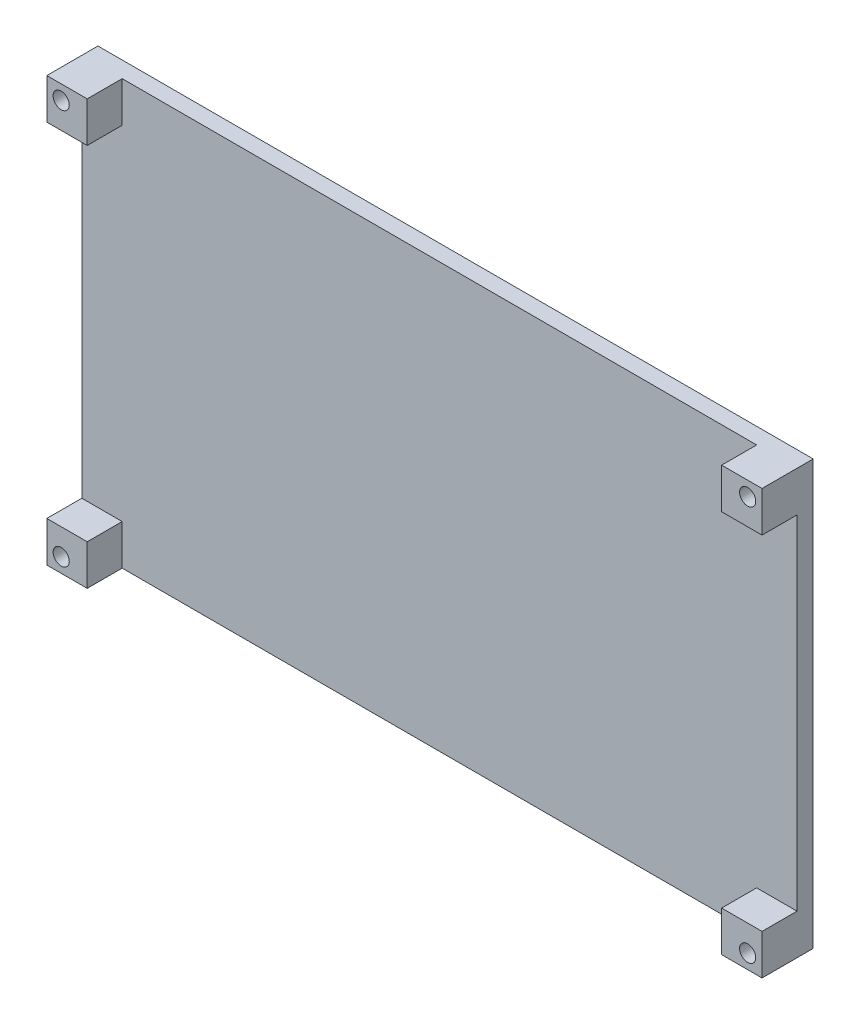
ISO-10303-21;
HEADER;
FILE_DESCRIPTION(('STEP AP214'),'2;1');
FILE_NAME('part.step','',(''),(''),'','','');
FILE_SCHEMA(('AUTOMOTIVE_DESIGN { 1 0 10303 214 1 1 1 1 }'));
ENDSEC;
DATA;
#1=APPLICATION_CONTEXT('core data for automotive mechanical design processes');
#2=APPLICATION_PROTOCOL_DEFINITION('international standard','automotive_design',2000,#1);
#3=PRODUCT_CONTEXT('',#1,'mechanical');
#4=PRODUCT('Part','Part','',(#3));
#5=PRODUCT_RELATED_PRODUCT_CATEGORY('part','',(#4));
#6=PRODUCT_DEFINITION_FORMATION('','',#4);
#7=PRODUCT_DEFINITION_CONTEXT('part definition',#1,'design');
#8=PRODUCT_DEFINITION('design','',#6,#7);
#9=PRODUCT_DEFINITION_SHAPE('','',#8);
#10=(LENGTH_UNIT() NAMED_UNIT(*) SI_UNIT(.MILLI.,.METRE.));
#11=(NAMED_UNIT(*) PLANE_ANGLE_UNIT() SI_UNIT($,.RADIAN.));
#12=(NAMED_UNIT(*) SI_UNIT($,.STERADIAN.) SOLID_ANGLE_UNIT());
#13=UNCERTAINTY_MEASURE_WITH_UNIT(LENGTH_MEASURE(1.E-05),#10,'distance_accuracy_value','');
#14=(GEOMETRIC_REPRESENTATION_CONTEXT(3) GLOBAL_UNCERTAINTY_ASSIGNED_CONTEXT((#13)) GLOBAL_UNIT_ASSIGNED_CONTEXT((#10,
#11,#12)) REPRESENTATION_CONTEXT('',''));
#15=CARTESIAN_POINT('',(0.,0.,0.));
#16=DIRECTION('',(0.,0.,1.));
#17=DIRECTION('',(1.,0.,0.));
#18=AXIS2_PLACEMENT_3D('',#15,#16,#17);
#19=CARTESIAN_POINT('',(6.975,0.,-36.5));
#20=DIRECTION('',(1.,0.,0.));
#21=DIRECTION('',(0.,1.,0.));
#22=AXIS2_PLACEMENT_3D('',#19,#20,#21);
#23=PLANE('',#22);
#24=CARTESIAN_POINT('',(6.975,-31.37,-16.5));
#25=DIRECTION('',(1.,0.,0.));
#26=DIRECTION('',(0.,1.,0.));
#27=AXIS2_PLACEMENT_3D('',#24,#25,#26);
#28=CIRCLE('',#27,2.);
#29=CARTESIAN_POINT('',(6.975,-29.37,-16.5));
#30=VERTEX_POINT('',#29);
#31=EDGE_CURVE('E203',#30,#30,#28,.T.);
#32=ORIENTED_EDGE('',*,*,#31,.T.);
#33=EDGE_LOOP('',(#32));
#34=FACE_BOUND('',#33,.T.);
#35=DIRECTION('',(0.,0.581238193719096,0.813733471206735));
#36=VECTOR('',#35,1.);
#37=CARTESIAN_POINT('',(6.97499999999999,-26.0693243243243,-17.8790540540541));
#38=LINE('',#37,#36);
#39=CARTESIAN_POINT('',(6.97499999999999,-25.7669989659495,-17.4557985523293));
#40=VERTEX_POINT('',#39);
#41=CARTESIAN_POINT('',(6.97499999999998,-14.37,-1.5));
#42=VERTEX_POINT('',#41);
#43=EDGE_CURVE('E213',#40,#42,#38,.T.);
#44=ORIENTED_EDGE('',*,*,#43,.F.);
#45=CARTESIAN_POINT('',(6.97500000000001,-31.87,-13.0965120994361));
#46=DIRECTION('',(1.,0.,0.));
#47=DIRECTION('',(0.,1.,0.));
#48=AXIS2_PLACEMENT_3D('',#45,#46,#47);
#49=CIRCLE('',#48,7.5);
#50=CARTESIAN_POINT('',(6.97499999999999,-39.37,-13.0965120994361));
#51=VERTEX_POINT('',#50);
#52=EDGE_CURVE('E403',#40,#51,#49,.F.);
#53=ORIENTED_EDGE('',*,*,#52,.T.);
#54=DIRECTION('',(0.,0.,1.));
#55=VECTOR('',#54,1.);
#56=CARTESIAN_POINT('',(6.97499999999999,-39.37,-36.5));
#57=LINE('',#56,#55);
#58=CARTESIAN_POINT('',(6.97499999999999,-39.37,-1.5));
#59=VERTEX_POINT('',#58);
#60=EDGE_CURVE('E238',#51,#59,#57,.T.);
#61=ORIENTED_EDGE('',*,*,#60,.T.);
#62=DIRECTION('',(0.,1.,0.));
#63=VECTOR('',#62,1.);
#64=CARTESIAN_POINT('',(6.975,0.,-1.5));
#65=LINE('',#64,#63);
#66=EDGE_CURVE('E227',#59,#42,#65,.T.);
#67=ORIENTED_EDGE('',*,*,#66,.T.);
#68=EDGE_LOOP('',(#44,#53,#61,#67));
#69=FACE_BOUND('',#68,.T.);
#70=ADVANCED_FACE('F34',(#34,#69),#23,.F.);
#71=CARTESIAN_POINT('',(16.975,0.,-36.5));
#72=DIRECTION('',(1.,0.,0.));
#73=DIRECTION('',(0.,0.,-1.));
#74=AXIS2_PLACEMENT_3D('',#71,#72,#73);
#75=PLANE('',#74);
#76=CARTESIAN_POINT('',(16.975,-31.37,-16.5));
#77=DIRECTION('',(1.,0.,0.));
#78=DIRECTION('',(0.,0.,-1.));
#79=AXIS2_PLACEMENT_3D('',#76,#77,#78);
#80=CIRCLE('',#79,2.);
#81=CARTESIAN_POINT('',(16.975,-31.37,-18.5));
#82=VERTEX_POINT('',#81);
#83=EDGE_CURVE('E400',#82,#82,#80,.T.);
#84=ORIENTED_EDGE('',*,*,#83,.F.);
#85=EDGE_LOOP('',(#84));
#86=FACE_BOUND('',#85,.T.);
#87=DIRECTION('',(0.,0.,1.));
#88=VECTOR('',#87,1.);
#89=CARTESIAN_POINT('',(16.975,-39.37,-36.5));
#90=LINE('',#89,#88);
#91=CARTESIAN_POINT('',(16.975,-39.37,-13.0965120994361));
#92=VERTEX_POINT('',#91);
#93=CARTESIAN_POINT('',(16.975,-39.37,-1.5));
#94=VERTEX_POINT('',#93);
#95=EDGE_CURVE('E236',#92,#94,#90,.T.);
#96=ORIENTED_EDGE('',*,*,#95,.F.);
#97=CARTESIAN_POINT('',(16.975,-31.87,-13.0965120994361));
#98=DIRECTION('',(1.,0.,0.));
#99=DIRECTION('',(0.,0.,-1.));
#100=AXIS2_PLACEMENT_3D('',#97,#98,#99);
#101=CIRCLE('',#100,7.5);
#102=CARTESIAN_POINT('',(16.975,-25.7669989659495,-17.4557985523293));
#103=VERTEX_POINT('',#102);
#104=EDGE_CURVE('E409',#92,#103,#101,.T.);
#105=ORIENTED_EDGE('',*,*,#104,.T.);
#106=DIRECTION('',(0.,0.581238193719096,0.813733471206735));
#107=VECTOR('',#106,1.);
#108=CARTESIAN_POINT('',(16.975,-26.0693243243243,-17.8790540540541));
#109=LINE('',#108,#107);
#110=CARTESIAN_POINT('',(16.975,-14.37,-1.5));
#111=VERTEX_POINT('',#110);
#112=EDGE_CURVE('E202',#103,#111,#109,.T.);
#113=ORIENTED_EDGE('',*,*,#112,.T.);
#114=DIRECTION('',(0.,1.,0.));
#115=VECTOR('',#114,1.);
#116=CARTESIAN_POINT('',(16.975,0.,-1.5));
#117=LINE('',#116,#115);
#118=EDGE_CURVE('E233',#94,#111,#117,.T.);
#119=ORIENTED_EDGE('',*,*,#118,.F.);
#120=EDGE_LOOP('',(#96,#105,#113,#119));
#121=FACE_BOUND('',#120,.T.);
#122=ADVANCED_FACE('F422',(#86,#121),#75,.T.);
#123=CARTESIAN_POINT('',(-6.975,0.,-36.5));
#124=DIRECTION('',(1.,0.,0.));
#125=DIRECTION('',(0.,1.,0.));
#126=AXIS2_PLACEMENT_3D('',#123,#124,#125);
#127=PLANE('',#126);
#128=CARTESIAN_POINT('',(-6.975,-31.37,-16.5));
#129=DIRECTION('',(1.,0.,0.));
#130=DIRECTION('',(0.,1.,0.));
#131=AXIS2_PLACEMENT_3D('',#128,#129,#130);
#132=CIRCLE('',#131,2.);
#133=CARTESIAN_POINT('',(-6.975,-29.37,-16.5));
#134=VERTEX_POINT('',#133);
#135=EDGE_CURVE('E399',#134,#134,#132,.T.);
#136=ORIENTED_EDGE('',*,*,#135,.F.);
#137=EDGE_LOOP('',(#136));
#138=FACE_BOUND('',#137,.T.);
#139=DIRECTION('',(0.,0.,1.));
#140=VECTOR('',#139,1.);
#141=CARTESIAN_POINT('',(-6.975,-39.37,-36.5));
#142=LINE('',#141,#140);
#143=CARTESIAN_POINT('',(-6.975,-39.37,-13.0965120994361));
#144=VERTEX_POINT('',#143);
#145=CARTESIAN_POINT('',(-6.975,-39.37,-1.5));
#146=VERTEX_POINT('',#145);
#147=EDGE_CURVE('E221',#144,#146,#142,.T.);
#148=ORIENTED_EDGE('',*,*,#147,.F.);
#149=CARTESIAN_POINT('',(-6.97500000000001,-31.87,-13.0965120994361));
#150=DIRECTION('',(1.,0.,0.));
#151=DIRECTION('',(0.,1.,0.));
#152=AXIS2_PLACEMENT_3D('',#149,#150,#151);
#153=CIRCLE('',#152,7.5);
#154=CARTESIAN_POINT('',(-6.975,-25.7669989659495,-17.4557985523293));
#155=VERTEX_POINT('',#154);
#156=EDGE_CURVE('E11',#144,#155,#153,.T.);
#157=ORIENTED_EDGE('',*,*,#156,.T.);
#158=DIRECTION('',(0.,0.581238193719096,0.813733471206735));
#159=VECTOR('',#158,1.);
#160=CARTESIAN_POINT('',(-6.975,-26.0693243243243,-17.8790540540541));
#161=LINE('',#160,#159);
#162=CARTESIAN_POINT('',(-6.975,-14.37,-1.5));
#163=VERTEX_POINT('',#162);
#164=EDGE_CURVE('E393',#155,#163,#161,.T.);
#165=ORIENTED_EDGE('',*,*,#164,.T.);
#166=DIRECTION('',(0.,1.,0.));
#167=VECTOR('',#166,1.);
#168=CARTESIAN_POINT('',(-6.975,0.,-1.5));
#169=LINE('',#168,#167);
#170=EDGE_CURVE('E219',#146,#163,#169,.T.);
#171=ORIENTED_EDGE('',*,*,#170,.F.);
#172=EDGE_LOOP('',(#148,#157,#165,#171));
#173=FACE_BOUND('',#172,.T.);
#174=ADVANCED_FACE('F428',(#138,#173),#127,.T.);
#175=CARTESIAN_POINT('',(0.,0.,-1.5));
#176=DIRECTION('',(0.,0.,1.));
#177=DIRECTION('',(1.,0.,0.));
#178=AXIS2_PLACEMENT_3D('',#175,#176,#177);
#179=PLANE('',#178);
#180=ORIENTED_EDGE('',*,*,#170,.T.);
#181=DIRECTION('',(1.,0.,0.));
#182=VECTOR('',#181,1.);
#183=CARTESIAN_POINT('',(0.,-14.37,-1.5));
#184=LINE('',#183,#182);
#185=CARTESIAN_POINT('',(-16.975,-14.37,-1.5));
#186=VERTEX_POINT('',#185);
#187=EDGE_CURVE('E198',#186,#163,#184,.T.);
#188=ORIENTED_EDGE('',*,*,#187,.F.);
#189=DIRECTION('',(0.,1.,0.));
#190=VECTOR('',#189,1.);
#191=CARTESIAN_POINT('',(-16.975,0.,-1.5));
#192=LINE('',#191,#190);
#193=CARTESIAN_POINT('',(-16.975,-39.37,-1.5));
#194=VERTEX_POINT('',#193);
#195=EDGE_CURVE('E206',#194,#186,#192,.T.);
#196=ORIENTED_EDGE('',*,*,#195,.F.);
#197=DIRECTION('',(1.,0.,0.));
#198=VECTOR('',#197,1.);
#199=CARTESIAN_POINT('',(0.,-39.37,-1.5));
#200=LINE('',#199,#198);
#201=CARTESIAN_POINT('',(-66.42,-39.37,-1.5));
#202=VERTEX_POINT('',#201);
#203=EDGE_CURVE('E344',#202,#194,#200,.T.);
#204=ORIENTED_EDGE('',*,*,#203,.F.);
#205=DIRECTION('',(0.,1.,0.));
#206=VECTOR('',#205,1.);
#207=CARTESIAN_POINT('',(-66.42,0.,-1.5));
#208=LINE('',#207,#206);
#209=CARTESIAN_POINT('',(-66.42,39.37,-1.5));
#210=VERTEX_POINT('',#209);
#211=EDGE_CURVE('E327',#202,#210,#208,.T.);
#212=ORIENTED_EDGE('',*,*,#211,.T.);
#213=DIRECTION('',(1.,0.,0.));
#214=VECTOR('',#213,1.);
#215=CARTESIAN_POINT('',(0.,39.37,-1.5));
#216=LINE('',#215,#214);
#217=CARTESIAN_POINT('',(66.42,39.37,-1.5));
#218=VERTEX_POINT('',#217);
#219=EDGE_CURVE('E350',#210,#218,#216,.T.);
#220=ORIENTED_EDGE('',*,*,#219,.T.);
#221=DIRECTION('',(0.,1.,0.));
#222=VECTOR('',#221,1.);
#223=CARTESIAN_POINT('',(66.42,0.,-1.5));
#224=LINE('',#223,#222);
#225=CARTESIAN_POINT('',(66.42,-39.37,-1.5));
#226=VERTEX_POINT('',#225);
#227=EDGE_CURVE('E346',#226,#218,#224,.T.);
#228=ORIENTED_EDGE('',*,*,#227,.F.);
#229=EDGE_CURVE('E343',#94,#226,#200,.T.);
#230=ORIENTED_EDGE('',*,*,#229,.F.);
#231=ORIENTED_EDGE('',*,*,#118,.T.);
#232=DIRECTION('',(-1.,0.,0.));
#233=VECTOR('',#232,1.);
#234=CARTESIAN_POINT('',(0.,-14.37,-1.5));
#235=LINE('',#234,#233);
#236=EDGE_CURVE('E230',#111,#42,#235,.T.);
#237=ORIENTED_EDGE('',*,*,#236,.T.);
#238=ORIENTED_EDGE('',*,*,#66,.F.);
#239=EDGE_CURVE('E347',#146,#59,#200,.T.);
#240=ORIENTED_EDGE('',*,*,#239,.F.);
#241=EDGE_LOOP('',(#180,#188,#196,#204,#212,#220,#228,#230,#231,#237,#238,#240));
#242=FACE_BOUND('',#241,.T.);
#243=CARTESIAN_POINT('',(-63.75,36.7,-1.5));
#244=DIRECTION('',(0.,0.,1.));
#245=DIRECTION('',(1.,0.,0.));
#246=AXIS2_PLACEMENT_3D('',#243,#244,#245);
#247=CIRCLE('',#246,1.5);
#248=CARTESIAN_POINT('',(-62.25,36.7,-1.5));
#249=VERTEX_POINT('',#248);
#250=EDGE_CURVE('E353',#249,#249,#247,.T.);
#251=ORIENTED_EDGE('',*,*,#250,.T.);
#252=EDGE_LOOP('',(#251));
#253=FACE_BOUND('',#252,.T.);
#254=CARTESIAN_POINT('',(63.75,36.7,-1.5));
#255=DIRECTION('',(0.,0.,1.));
#256=DIRECTION('',(1.,0.,0.));
#257=AXIS2_PLACEMENT_3D('',#254,#255,#256);
#258=CIRCLE('',#257,1.50000000000001);
#259=CARTESIAN_POINT('',(65.25,36.7,-1.5));
#260=VERTEX_POINT('',#259);
#261=EDGE_CURVE('E356',#260,#260,#258,.F.);
#262=ORIENTED_EDGE('',*,*,#261,.F.);
#263=EDGE_LOOP('',(#262));
#264=FACE_BOUND('',#263,.T.);
#265=CARTESIAN_POINT('',(63.75,-36.7,-1.5));
#266=DIRECTION('',(0.,0.,1.));
#267=DIRECTION('',(1.,0.,0.));
#268=AXIS2_PLACEMENT_3D('',#265,#266,#267);
#269=CIRCLE('',#268,1.50000000000001);
#270=CARTESIAN_POINT('',(65.25,-36.7,-1.5));
#271=VERTEX_POINT('',#270);
#272=EDGE_CURVE('E359',#271,#271,#269,.T.);
#273=ORIENTED_EDGE('',*,*,#272,.T.);
#274=EDGE_LOOP('',(#273));
#275=FACE_BOUND('',#274,.T.);
#276=CARTESIAN_POINT('',(-63.75,-36.7,-1.5));
#277=DIRECTION('',(0.,0.,1.));
#278=DIRECTION('',(1.,0.,0.));
#279=AXIS2_PLACEMENT_3D('',#276,#277,#278);
#280=CIRCLE('',#279,1.5);
#281=CARTESIAN_POINT('',(-62.25,-36.7,-1.5));
#282=VERTEX_POINT('',#281);
#283=EDGE_CURVE('E332',#282,#282,#280,.F.);
#284=ORIENTED_EDGE('',*,*,#283,.F.);
#285=EDGE_LOOP('',(#284));
#286=FACE_BOUND('',#285,.T.);
#287=ADVANCED_FACE('F215',(#242,#253,#264,#275,#286),#179,.F.);
#288=CARTESIAN_POINT('',(-66.42,0.,1.5));
#289=DIRECTION('',(-1.,0.,0.));
#290=DIRECTION('',(0.,0.,1.));
#291=AXIS2_PLACEMENT_3D('',#288,#289,#290);
#292=PLANE('',#291);
#293=DIRECTION('',(0.,1.,0.));
#294=VECTOR('',#293,1.);
#295=CARTESIAN_POINT('',(-66.42,0.,1.5));
#296=LINE('',#295,#294);
#297=CARTESIAN_POINT('',(-66.42,-31.87,1.5));
#298=VERTEX_POINT('',#297);
#299=CARTESIAN_POINT('',(-66.42,31.87,1.5));
#300=VERTEX_POINT('',#299);
#301=EDGE_CURVE('E328',#298,#300,#296,.T.);
#302=ORIENTED_EDGE('',*,*,#301,.T.);
#303=DIRECTION('',(0.,0.,-1.));
#304=VECTOR('',#303,1.);
#305=CARTESIAN_POINT('',(-66.42,31.87,8.));
#306=LINE('',#305,#304);
#307=CARTESIAN_POINT('',(-66.42,31.87,8.));
#308=VERTEX_POINT('',#307);
#309=EDGE_CURVE('E301',#308,#300,#306,.T.);
#310=ORIENTED_EDGE('',*,*,#309,.F.);
#311=DIRECTION('',(0.,1.,0.));
#312=VECTOR('',#311,1.);
#313=CARTESIAN_POINT('',(-66.42,0.,8.));
#314=LINE('',#313,#312);
#315=CARTESIAN_POINT('',(-66.42,39.37,8.));
#316=VERTEX_POINT('',#315);
#317=EDGE_CURVE('E293',#308,#316,#314,.T.);
#318=ORIENTED_EDGE('',*,*,#317,.T.);
#319=DIRECTION('',(0.,0.,-1.));
#320=VECTOR('',#319,1.);
#321=CARTESIAN_POINT('',(-66.42,39.37,1.5));
#322=LINE('',#321,#320);
#323=EDGE_CURVE('E340',#316,#210,#322,.T.);
#324=ORIENTED_EDGE('',*,*,#323,.T.);
#325=ORIENTED_EDGE('',*,*,#211,.F.);
#326=DIRECTION('',(0.,0.,-1.));
#327=VECTOR('',#326,1.);
#328=CARTESIAN_POINT('',(-66.42,-39.37,1.5));
#329=LINE('',#328,#327);
#330=CARTESIAN_POINT('',(-66.42,-39.37,8.));
#331=VERTEX_POINT('',#330);
#332=EDGE_CURVE('E370',#331,#202,#329,.T.);
#333=ORIENTED_EDGE('',*,*,#332,.F.);
#334=DIRECTION('',(0.,1.,0.));
#335=VECTOR('',#334,1.);
#336=CARTESIAN_POINT('',(-66.42,0.,8.));
#337=LINE('',#336,#335);
#338=CARTESIAN_POINT('',(-66.42,-31.87,8.));
#339=VERTEX_POINT('',#338);
#340=EDGE_CURVE('E309',#331,#339,#337,.T.);
#341=ORIENTED_EDGE('',*,*,#340,.T.);
#342=DIRECTION('',(0.,0.,-1.));
#343=VECTOR('',#342,1.);
#344=CARTESIAN_POINT('',(-66.42,-31.87,8.));
#345=LINE('',#344,#343);
#346=EDGE_CURVE('E324',#339,#298,#345,.T.);
#347=ORIENTED_EDGE('',*,*,#346,.T.);
#348=EDGE_LOOP('',(#302,#310,#318,#324,#325,#333,#341,#347));
#349=FACE_BOUND('',#348,.T.);
#350=ADVANCED_FACE('F490',(#349),#292,.T.);
#351=CARTESIAN_POINT('',(0.,-39.37,1.5));
#352=DIRECTION('',(0.,1.,0.));
#353=DIRECTION('',(0.,0.,1.));
#354=AXIS2_PLACEMENT_3D('',#351,#352,#353);
#355=PLANE('',#354);
#356=ORIENTED_EDGE('',*,*,#60,.F.);
#357=DIRECTION('',(-1.,0.,0.));
#358=VECTOR('',#357,1.);
#359=CARTESIAN_POINT('',(16.975,-39.37,-13.0965120994361));
#360=LINE('',#359,#358);
#361=EDGE_CURVE('E407',#51,#92,#360,.F.);
#362=ORIENTED_EDGE('',*,*,#361,.T.);
#363=ORIENTED_EDGE('',*,*,#95,.T.);
#364=ORIENTED_EDGE('',*,*,#229,.T.);
#365=DIRECTION('',(0.,0.,-1.));
#366=VECTOR('',#365,1.);
#367=CARTESIAN_POINT('',(66.42,-39.37,1.5));
#368=LINE('',#367,#366);
#369=CARTESIAN_POINT('',(66.42,-39.37,8.));
#370=VERTEX_POINT('',#369);
#371=EDGE_CURVE('E367',#370,#226,#368,.T.);
#372=ORIENTED_EDGE('',*,*,#371,.F.);
#373=DIRECTION('',(1.,0.,0.));
#374=VECTOR('',#373,1.);
#375=CARTESIAN_POINT('',(0.,-39.37,8.));
#376=LINE('',#375,#374);
#377=CARTESIAN_POINT('',(58.92,-39.37,8.));
#378=VERTEX_POINT('',#377);
#379=EDGE_CURVE('E246',#378,#370,#376,.T.);
#380=ORIENTED_EDGE('',*,*,#379,.F.);
#381=DIRECTION('',(0.,0.,-1.));
#382=VECTOR('',#381,1.);
#383=CARTESIAN_POINT('',(58.92,-39.37,8.));
#384=LINE('',#383,#382);
#385=CARTESIAN_POINT('',(58.92,-39.37,1.5));
#386=VERTEX_POINT('',#385);
#387=EDGE_CURVE('E259',#378,#386,#384,.T.);
#388=ORIENTED_EDGE('',*,*,#387,.T.);
#389=DIRECTION('',(1.,0.,0.));
#390=VECTOR('',#389,1.);
#391=CARTESIAN_POINT('',(0.,-39.37,1.5));
#392=LINE('',#391,#390);
#393=CARTESIAN_POINT('',(-58.92,-39.37,1.5));
#394=VERTEX_POINT('',#393);
#395=EDGE_CURVE('E331',#394,#386,#392,.T.);
#396=ORIENTED_EDGE('',*,*,#395,.F.);
#397=DIRECTION('',(0.,0.,-1.));
#398=VECTOR('',#397,1.);
#399=CARTESIAN_POINT('',(-58.92,-39.37,8.));
#400=LINE('',#399,#398);
#401=CARTESIAN_POINT('',(-58.92,-39.37,8.));
#402=VERTEX_POINT('',#401);
#403=EDGE_CURVE('E322',#402,#394,#400,.T.);
#404=ORIENTED_EDGE('',*,*,#403,.F.);
#405=DIRECTION('',(1.,0.,0.));
#406=VECTOR('',#405,1.);
#407=CARTESIAN_POINT('',(0.,-39.37,8.));
#408=LINE('',#407,#406);
#409=EDGE_CURVE('E312',#331,#402,#408,.T.);
#410=ORIENTED_EDGE('',*,*,#409,.F.);
#411=ORIENTED_EDGE('',*,*,#332,.T.);
#412=ORIENTED_EDGE('',*,*,#203,.T.);
#413=DIRECTION('',(0.,0.,1.));
#414=VECTOR('',#413,1.);
#415=CARTESIAN_POINT('',(-16.975,-39.37,-36.5));
#416=LINE('',#415,#414);
#417=CARTESIAN_POINT('',(-16.975,-39.37,-13.0965120994361));
#418=VERTEX_POINT('',#417);
#419=EDGE_CURVE('E209',#418,#194,#416,.T.);
#420=ORIENTED_EDGE('',*,*,#419,.F.);
#421=DIRECTION('',(-1.,0.,0.));
#422=VECTOR('',#421,1.);
#423=CARTESIAN_POINT('',(-6.97500000000001,-39.37,-13.0965120994361));
#424=LINE('',#423,#422);
#425=EDGE_CURVE('E405',#418,#144,#424,.F.);
#426=ORIENTED_EDGE('',*,*,#425,.T.);
#427=ORIENTED_EDGE('',*,*,#147,.T.);
#428=ORIENTED_EDGE('',*,*,#239,.T.);
#429=EDGE_LOOP('',(#356,#362,#363,#364,#372,#380,#388,#396,#404,#410,#411,#412,#420,#426,#427,#428));
#430=FACE_BOUND('',#429,.T.);
#431=ADVANCED_FACE('F413',(#430),#355,.F.);
#432=CARTESIAN_POINT('',(66.42,0.,1.5));
#433=DIRECTION('',(-1.,0.,0.));
#434=DIRECTION('',(0.,0.,1.));
#435=AXIS2_PLACEMENT_3D('',#432,#433,#434);
#436=PLANE('',#435);
#437=DIRECTION('',(0.,1.,0.));
#438=VECTOR('',#437,1.);
#439=CARTESIAN_POINT('',(66.42,0.,1.5));
#440=LINE('',#439,#438);
#441=CARTESIAN_POINT('',(66.42,-31.87,1.5));
#442=VERTEX_POINT('',#441);
#443=CARTESIAN_POINT('',(66.42,31.87,1.5));
#444=VERTEX_POINT('',#443);
#445=EDGE_CURVE('E335',#442,#444,#440,.T.);
#446=ORIENTED_EDGE('',*,*,#445,.F.);
#447=DIRECTION('',(0.,0.,-1.));
#448=VECTOR('',#447,1.);
#449=CARTESIAN_POINT('',(66.42,-31.87,8.));
#450=LINE('',#449,#448);
#451=CARTESIAN_POINT('',(66.42,-31.87,8.));
#452=VERTEX_POINT('',#451);
#453=EDGE_CURVE('E257',#452,#442,#450,.T.);
#454=ORIENTED_EDGE('',*,*,#453,.F.);
#455=DIRECTION('',(0.,1.,0.));
#456=VECTOR('',#455,1.);
#457=CARTESIAN_POINT('',(66.42,0.,8.));
#458=LINE('',#457,#456);
#459=EDGE_CURVE('E249',#370,#452,#458,.T.);
#460=ORIENTED_EDGE('',*,*,#459,.F.);
#461=ORIENTED_EDGE('',*,*,#371,.T.);
#462=ORIENTED_EDGE('',*,*,#227,.T.);
#463=DIRECTION('',(0.,0.,-1.));
#464=VECTOR('',#463,1.);
#465=CARTESIAN_POINT('',(66.42,39.37,1.5));
#466=LINE('',#465,#464);
#467=CARTESIAN_POINT('',(66.42,39.37,8.));
#468=VERTEX_POINT('',#467);
#469=EDGE_CURVE('E365',#468,#218,#466,.T.);
#470=ORIENTED_EDGE('',*,*,#469,.F.);
#471=DIRECTION('',(0.,1.,0.));
#472=VECTOR('',#471,1.);
#473=CARTESIAN_POINT('',(66.42,0.,8.));
#474=LINE('',#473,#472);
#475=CARTESIAN_POINT('',(66.42,31.87,8.));
#476=VERTEX_POINT('',#475);
#477=EDGE_CURVE('E265',#476,#468,#474,.T.);
#478=ORIENTED_EDGE('',*,*,#477,.F.);
#479=DIRECTION('',(0.,0.,-1.));
#480=VECTOR('',#479,1.);
#481=CARTESIAN_POINT('',(66.42,31.87,8.));
#482=LINE('',#481,#480);
#483=EDGE_CURVE('E281',#476,#444,#482,.T.);
#484=ORIENTED_EDGE('',*,*,#483,.T.);
#485=EDGE_LOOP('',(#446,#454,#460,#461,#462,#470,#478,#484));
#486=FACE_BOUND('',#485,.T.);
#487=ADVANCED_FACE('F499',(#486),#436,.F.);
#488=CARTESIAN_POINT('',(63.75,-36.7,1.5));
#489=DIRECTION('',(0.,0.,-1.));
#490=DIRECTION('',(-1.,0.,0.));
#491=AXIS2_PLACEMENT_3D('',#488,#489,#490);
#492=CYLINDRICAL_SURFACE('',#491,1.50000000000001);
#493=CARTESIAN_POINT('',(63.75,-36.7,8.));
#494=DIRECTION('',(0.,0.,1.));
#495=DIRECTION('',(1.,0.,0.));
#496=AXIS2_PLACEMENT_3D('',#493,#494,#495);
#497=CIRCLE('',#496,1.50000000000001);
#498=CARTESIAN_POINT('',(65.25,-36.7,8.));
#499=VERTEX_POINT('',#498);
#500=EDGE_CURVE('E240',#499,#499,#497,.T.);
#501=ORIENTED_EDGE('',*,*,#500,.T.);
#502=EDGE_LOOP('',(#501));
#503=FACE_BOUND('',#502,.T.);
#504=ORIENTED_EDGE('',*,*,#272,.F.);
#505=EDGE_LOOP('',(#504));
#506=FACE_BOUND('',#505,.T.);
#507=ADVANCED_FACE('F495',(#503,#506),#492,.F.);
#508=CARTESIAN_POINT('',(63.75,36.7,1.5));
#509=DIRECTION('',(0.,0.,-1.));
#510=DIRECTION('',(-1.,0.,0.));
#511=AXIS2_PLACEMENT_3D('',#508,#509,#510);
#512=CYLINDRICAL_SURFACE('',#511,1.50000000000001);
#513=CARTESIAN_POINT('',(63.75,36.7,8.));
#514=DIRECTION('',(0.,0.,1.));
#515=DIRECTION('',(1.,0.,0.));
#516=AXIS2_PLACEMENT_3D('',#513,#514,#515);
#517=CIRCLE('',#516,1.50000000000001);
#518=CARTESIAN_POINT('',(65.25,36.7,8.));
#519=VERTEX_POINT('',#518);
#520=EDGE_CURVE('E273',#519,#519,#517,.F.);
#521=ORIENTED_EDGE('',*,*,#520,.F.);
#522=EDGE_LOOP('',(#521));
#523=FACE_BOUND('',#522,.T.);
#524=ORIENTED_EDGE('',*,*,#261,.T.);
#525=EDGE_LOOP('',(#524));
#526=FACE_BOUND('',#525,.T.);
#527=ADVANCED_FACE('F498',(#523,#526),#512,.F.);
#528=CARTESIAN_POINT('',(-63.75,36.7,1.5));
#529=DIRECTION('',(0.,0.,-1.));
#530=DIRECTION('',(-1.,0.,0.));
#531=AXIS2_PLACEMENT_3D('',#528,#529,#530);
#532=CYLINDRICAL_SURFACE('',#531,1.5);
#533=CARTESIAN_POINT('',(-63.75,36.7,8.));
#534=DIRECTION('',(0.,0.,1.));
#535=DIRECTION('',(1.,0.,0.));
#536=AXIS2_PLACEMENT_3D('',#533,#534,#535);
#537=CIRCLE('',#536,1.5);
#538=CARTESIAN_POINT('',(-62.25,36.7,8.));
#539=VERTEX_POINT('',#538);
#540=EDGE_CURVE('E284',#539,#539,#537,.T.);
#541=ORIENTED_EDGE('',*,*,#540,.T.);
#542=EDGE_LOOP('',(#541));
#543=FACE_BOUND('',#542,.T.);
#544=ORIENTED_EDGE('',*,*,#250,.F.);
#545=EDGE_LOOP('',(#544));
#546=FACE_BOUND('',#545,.T.);
#547=ADVANCED_FACE('F503',(#543,#546),#532,.F.);
#548=CARTESIAN_POINT('',(0.,39.37,1.5));
#549=DIRECTION('',(0.,1.,0.));
#550=DIRECTION('',(0.,0.,1.));
#551=AXIS2_PLACEMENT_3D('',#548,#549,#550);
#552=PLANE('',#551);
#553=DIRECTION('',(1.,0.,0.));
#554=VECTOR('',#553,1.);
#555=CARTESIAN_POINT('',(0.,39.37,1.5));
#556=LINE('',#555,#554);
#557=CARTESIAN_POINT('',(-58.92,39.37,1.5));
#558=VERTEX_POINT('',#557);
#559=CARTESIAN_POINT('',(58.92,39.37,1.5));
#560=VERTEX_POINT('',#559);
#561=EDGE_CURVE('E337',#558,#560,#556,.T.);
#562=ORIENTED_EDGE('',*,*,#561,.T.);
#563=DIRECTION('',(0.,0.,-1.));
#564=VECTOR('',#563,1.);
#565=CARTESIAN_POINT('',(58.92,39.37,8.));
#566=LINE('',#565,#564);
#567=CARTESIAN_POINT('',(58.92,39.37,8.));
#568=VERTEX_POINT('',#567);
#569=EDGE_CURVE('E279',#568,#560,#566,.T.);
#570=ORIENTED_EDGE('',*,*,#569,.F.);
#571=DIRECTION('',(1.,0.,0.));
#572=VECTOR('',#571,1.);
#573=CARTESIAN_POINT('',(0.,39.37,8.));
#574=LINE('',#573,#572);
#575=EDGE_CURVE('E268',#568,#468,#574,.T.);
#576=ORIENTED_EDGE('',*,*,#575,.T.);
#577=ORIENTED_EDGE('',*,*,#469,.T.);
#578=ORIENTED_EDGE('',*,*,#219,.F.);
#579=ORIENTED_EDGE('',*,*,#323,.F.);
#580=DIRECTION('',(1.,0.,0.));
#581=VECTOR('',#580,1.);
#582=CARTESIAN_POINT('',(0.,39.37,8.));
#583=LINE('',#582,#581);
#584=CARTESIAN_POINT('',(-58.92,39.37,8.));
#585=VERTEX_POINT('',#584);
#586=EDGE_CURVE('E290',#316,#585,#583,.T.);
#587=ORIENTED_EDGE('',*,*,#586,.T.);
#588=DIRECTION('',(0.,0.,-1.));
#589=VECTOR('',#588,1.);
#590=CARTESIAN_POINT('',(-58.92,39.37,8.));
#591=LINE('',#590,#589);
#592=EDGE_CURVE('E303',#585,#558,#591,.T.);
#593=ORIENTED_EDGE('',*,*,#592,.T.);
#594=EDGE_LOOP('',(#562,#570,#576,#577,#578,#579,#587,#593));
#595=FACE_BOUND('',#594,.T.);
#596=ADVANCED_FACE('F493',(#595),#552,.T.);
#597=CARTESIAN_POINT('',(-63.75,-36.7,1.5));
#598=DIRECTION('',(0.,0.,-1.));
#599=DIRECTION('',(-1.,0.,0.));
#600=AXIS2_PLACEMENT_3D('',#597,#598,#599);
#601=CYLINDRICAL_SURFACE('',#600,1.5);
#602=CARTESIAN_POINT('',(-63.75,-36.7,8.));
#603=DIRECTION('',(0.,0.,1.));
#604=DIRECTION('',(1.,0.,0.));
#605=AXIS2_PLACEMENT_3D('',#602,#603,#604);
#606=CIRCLE('',#605,1.5);
#607=CARTESIAN_POINT('',(-62.25,-36.7,8.));
#608=VERTEX_POINT('',#607);
#609=EDGE_CURVE('E316',#608,#608,#606,.F.);
#610=ORIENTED_EDGE('',*,*,#609,.F.);
#611=EDGE_LOOP('',(#610));
#612=FACE_BOUND('',#611,.T.);
#613=ORIENTED_EDGE('',*,*,#283,.T.);
#614=EDGE_LOOP('',(#613));
#615=FACE_BOUND('',#614,.T.);
#616=ADVANCED_FACE('F486',(#612,#615),#601,.F.);
#617=CARTESIAN_POINT('',(0.,0.,1.5));
#618=DIRECTION('',(0.,0.,1.));
#619=DIRECTION('',(1.,0.,0.));
#620=AXIS2_PLACEMENT_3D('',#617,#618,#619);
#621=PLANE('',#620);
#622=DIRECTION('',(0.,-1.,0.));
#623=VECTOR('',#622,1.);
#624=CARTESIAN_POINT('',(58.9199999999999,1.0902390101819E-13,1.5));
#625=LINE('',#624,#623);
#626=CARTESIAN_POINT('',(58.92,-31.87,1.5));
#627=VERTEX_POINT('',#626);
#628=EDGE_CURVE('E391',#627,#386,#625,.T.);
#629=ORIENTED_EDGE('',*,*,#628,.F.);
#630=DIRECTION('',(1.,0.,0.));
#631=VECTOR('',#630,1.);
#632=CARTESIAN_POINT('',(0.,-31.87,1.5));
#633=LINE('',#632,#631);
#634=EDGE_CURVE('E388',#627,#442,#633,.T.);
#635=ORIENTED_EDGE('',*,*,#634,.T.);
#636=ORIENTED_EDGE('',*,*,#445,.T.);
#637=DIRECTION('',(1.,0.,0.));
#638=VECTOR('',#637,1.);
#639=CARTESIAN_POINT('',(0.,31.87,1.5));
#640=LINE('',#639,#638);
#641=CARTESIAN_POINT('',(58.92,31.87,1.5));
#642=VERTEX_POINT('',#641);
#643=EDGE_CURVE('E385',#642,#444,#640,.T.);
#644=ORIENTED_EDGE('',*,*,#643,.F.);
#645=DIRECTION('',(0.,1.,0.));
#646=VECTOR('',#645,1.);
#647=CARTESIAN_POINT('',(58.9199999999999,-1.0902390101819E-13,1.5));
#648=LINE('',#647,#646);
#649=EDGE_CURVE('E382',#642,#560,#648,.T.);
#650=ORIENTED_EDGE('',*,*,#649,.T.);
#651=ORIENTED_EDGE('',*,*,#561,.F.);
#652=DIRECTION('',(0.,1.,0.));
#653=VECTOR('',#652,1.);
#654=CARTESIAN_POINT('',(-58.9199999999999,-1.0902390101819E-13,1.5));
#655=LINE('',#654,#653);
#656=CARTESIAN_POINT('',(-58.92,31.87,1.5));
#657=VERTEX_POINT('',#656);
#658=EDGE_CURVE('E380',#657,#558,#655,.T.);
#659=ORIENTED_EDGE('',*,*,#658,.F.);
#660=DIRECTION('',(-1.,0.,0.));
#661=VECTOR('',#660,1.);
#662=CARTESIAN_POINT('',(0.,31.87,1.5));
#663=LINE('',#662,#661);
#664=EDGE_CURVE('E377',#657,#300,#663,.T.);
#665=ORIENTED_EDGE('',*,*,#664,.T.);
#666=ORIENTED_EDGE('',*,*,#301,.F.);
#667=DIRECTION('',(-1.,0.,0.));
#668=VECTOR('',#667,1.);
#669=CARTESIAN_POINT('',(0.,-31.87,1.5));
#670=LINE('',#669,#668);
#671=CARTESIAN_POINT('',(-58.92,-31.87,1.5));
#672=VERTEX_POINT('',#671);
#673=EDGE_CURVE('E375',#672,#298,#670,.T.);
#674=ORIENTED_EDGE('',*,*,#673,.F.);
#675=DIRECTION('',(0.,-1.,0.));
#676=VECTOR('',#675,1.);
#677=CARTESIAN_POINT('',(-58.9199999999999,1.0902390101819E-13,1.5));
#678=LINE('',#677,#676);
#679=EDGE_CURVE('E372',#672,#394,#678,.T.);
#680=ORIENTED_EDGE('',*,*,#679,.T.);
#681=ORIENTED_EDGE('',*,*,#395,.T.);
#682=EDGE_LOOP('',(#629,#635,#636,#644,#650,#651,#659,#665,#666,#674,#680,#681));
#683=FACE_BOUND('',#682,.T.);
#684=ADVANCED_FACE('F482',(#683),#621,.T.);
#685=CARTESIAN_POINT('',(0.,-31.87,8.));
#686=DIRECTION('',(0.,1.,0.));
#687=DIRECTION('',(0.,0.,1.));
#688=AXIS2_PLACEMENT_3D('',#685,#686,#687);
#689=PLANE('',#688);
#690=DIRECTION('',(0.,0.,-1.));
#691=VECTOR('',#690,1.);
#692=CARTESIAN_POINT('',(-58.92,-31.87,8.));
#693=LINE('',#692,#691);
#694=CARTESIAN_POINT('',(-58.92,-31.87,8.));
#695=VERTEX_POINT('',#694);
#696=EDGE_CURVE('E319',#695,#672,#693,.T.);
#697=ORIENTED_EDGE('',*,*,#696,.T.);
#698=ORIENTED_EDGE('',*,*,#673,.T.);
#699=ORIENTED_EDGE('',*,*,#346,.F.);
#700=DIRECTION('',(1.,0.,0.));
#701=VECTOR('',#700,1.);
#702=CARTESIAN_POINT('',(0.,-31.87,8.));
#703=LINE('',#702,#701);
#704=EDGE_CURVE('E306',#339,#695,#703,.T.);
#705=ORIENTED_EDGE('',*,*,#704,.T.);
#706=EDGE_LOOP('',(#697,#698,#699,#705));
#707=FACE_BOUND('',#706,.T.);
#708=ADVANCED_FACE('F478',(#707),#689,.T.);
#709=CARTESIAN_POINT('',(-58.9199999999999,1.0902390101819E-13,8.));
#710=DIRECTION('',(-1.,0.,0.));
#711=DIRECTION('',(0.,-1.,0.));
#712=AXIS2_PLACEMENT_3D('',#709,#710,#711);
#713=PLANE('',#712);
#714=ORIENTED_EDGE('',*,*,#679,.F.);
#715=ORIENTED_EDGE('',*,*,#696,.F.);
#716=DIRECTION('',(0.,1.,0.));
#717=VECTOR('',#716,1.);
#718=CARTESIAN_POINT('',(-58.9199999999999,1.0902390101819E-13,8.));
#719=LINE('',#718,#717);
#720=EDGE_CURVE('E314',#402,#695,#719,.T.);
#721=ORIENTED_EDGE('',*,*,#720,.F.);
#722=ORIENTED_EDGE('',*,*,#403,.T.);
#723=EDGE_LOOP('',(#714,#715,#721,#722));
#724=FACE_BOUND('',#723,.T.);
#725=ADVANCED_FACE('F474',(#724),#713,.F.);
#726=CARTESIAN_POINT('',(0.,0.,8.));
#727=DIRECTION('',(0.,0.,1.));
#728=DIRECTION('',(1.,0.,0.));
#729=AXIS2_PLACEMENT_3D('',#726,#727,#728);
#730=PLANE('',#729);
#731=ORIENTED_EDGE('',*,*,#704,.F.);
#732=ORIENTED_EDGE('',*,*,#340,.F.);
#733=ORIENTED_EDGE('',*,*,#409,.T.);
#734=ORIENTED_EDGE('',*,*,#720,.T.);
#735=EDGE_LOOP('',(#731,#732,#733,#734));
#736=FACE_BOUND('',#735,.T.);
#737=ORIENTED_EDGE('',*,*,#609,.T.);
#738=EDGE_LOOP('',(#737));
#739=FACE_BOUND('',#738,.T.);
#740=ADVANCED_FACE('F470',(#736,#739),#730,.T.);
#741=CARTESIAN_POINT('',(-58.9199999999999,-1.0902390101819E-13,8.));
#742=DIRECTION('',(1.,0.,0.));
#743=DIRECTION('',(0.,1.,0.));
#744=AXIS2_PLACEMENT_3D('',#741,#742,#743);
#745=PLANE('',#744);
#746=DIRECTION('',(0.,0.,-1.));
#747=VECTOR('',#746,1.);
#748=CARTESIAN_POINT('',(-58.92,31.87,8.));
#749=LINE('',#748,#747);
#750=CARTESIAN_POINT('',(-58.92,31.87,8.));
#751=VERTEX_POINT('',#750);
#752=EDGE_CURVE('E298',#751,#657,#749,.T.);
#753=ORIENTED_EDGE('',*,*,#752,.T.);
#754=ORIENTED_EDGE('',*,*,#658,.T.);
#755=ORIENTED_EDGE('',*,*,#592,.F.);
#756=DIRECTION('',(0.,-1.,0.));
#757=VECTOR('',#756,1.);
#758=CARTESIAN_POINT('',(-58.9199999999999,-1.0902390101819E-13,8.));
#759=LINE('',#758,#757);
#760=EDGE_CURVE('E287',#585,#751,#759,.T.);
#761=ORIENTED_EDGE('',*,*,#760,.T.);
#762=EDGE_LOOP('',(#753,#754,#755,#761));
#763=FACE_BOUND('',#762,.T.);
#764=ADVANCED_FACE('F466',(#763),#745,.T.);
#765=CARTESIAN_POINT('',(0.,31.87,8.));
#766=DIRECTION('',(0.,1.,0.));
#767=DIRECTION('',(0.,0.,1.));
#768=AXIS2_PLACEMENT_3D('',#765,#766,#767);
#769=PLANE('',#768);
#770=ORIENTED_EDGE('',*,*,#664,.F.);
#771=ORIENTED_EDGE('',*,*,#752,.F.);
#772=DIRECTION('',(1.,0.,0.));
#773=VECTOR('',#772,1.);
#774=CARTESIAN_POINT('',(0.,31.87,8.));
#775=LINE('',#774,#773);
#776=EDGE_CURVE('E296',#308,#751,#775,.T.);
#777=ORIENTED_EDGE('',*,*,#776,.F.);
#778=ORIENTED_EDGE('',*,*,#309,.T.);
#779=EDGE_LOOP('',(#770,#771,#777,#778));
#780=FACE_BOUND('',#779,.T.);
#781=ADVANCED_FACE('F462',(#780),#769,.F.);
#782=CARTESIAN_POINT('',(0.,0.,8.));
#783=DIRECTION('',(0.,0.,1.));
#784=DIRECTION('',(1.,0.,0.));
#785=AXIS2_PLACEMENT_3D('',#782,#783,#784);
#786=PLANE('',#785);
#787=ORIENTED_EDGE('',*,*,#540,.F.);
#788=EDGE_LOOP('',(#787));
#789=FACE_BOUND('',#788,.T.);
#790=ORIENTED_EDGE('',*,*,#760,.F.);
#791=ORIENTED_EDGE('',*,*,#586,.F.);
#792=ORIENTED_EDGE('',*,*,#317,.F.);
#793=ORIENTED_EDGE('',*,*,#776,.T.);
#794=EDGE_LOOP('',(#790,#791,#792,#793));
#795=FACE_BOUND('',#794,.T.);
#796=ADVANCED_FACE('F458',(#789,#795),#786,.T.);
#797=CARTESIAN_POINT('',(0.,31.87,8.));
#798=DIRECTION('',(0.,-1.,0.));
#799=DIRECTION('',(0.,0.,-1.));
#800=AXIS2_PLACEMENT_3D('',#797,#798,#799);
#801=PLANE('',#800);
#802=DIRECTION('',(0.,0.,-1.));
#803=VECTOR('',#802,1.);
#804=CARTESIAN_POINT('',(58.92,31.87,8.));
#805=LINE('',#804,#803);
#806=CARTESIAN_POINT('',(58.92,31.87,8.));
#807=VERTEX_POINT('',#806);
#808=EDGE_CURVE('E276',#807,#642,#805,.T.);
#809=ORIENTED_EDGE('',*,*,#808,.T.);
#810=ORIENTED_EDGE('',*,*,#643,.T.);
#811=ORIENTED_EDGE('',*,*,#483,.F.);
#812=DIRECTION('',(-1.,0.,0.));
#813=VECTOR('',#812,1.);
#814=CARTESIAN_POINT('',(0.,31.87,8.));
#815=LINE('',#814,#813);
#816=EDGE_CURVE('E262',#476,#807,#815,.T.);
#817=ORIENTED_EDGE('',*,*,#816,.T.);
#818=EDGE_LOOP('',(#809,#810,#811,#817));
#819=FACE_BOUND('',#818,.T.);
#820=ADVANCED_FACE('F454',(#819),#801,.T.);
#821=CARTESIAN_POINT('',(58.9199999999999,-1.0902390101819E-13,8.));
#822=DIRECTION('',(1.,0.,0.));
#823=DIRECTION('',(0.,1.,0.));
#824=AXIS2_PLACEMENT_3D('',#821,#822,#823);
#825=PLANE('',#824);
#826=ORIENTED_EDGE('',*,*,#649,.F.);
#827=ORIENTED_EDGE('',*,*,#808,.F.);
#828=DIRECTION('',(0.,-1.,0.));
#829=VECTOR('',#828,1.);
#830=CARTESIAN_POINT('',(58.9199999999999,-1.0902390101819E-13,8.));
#831=LINE('',#830,#829);
#832=EDGE_CURVE('E271',#568,#807,#831,.T.);
#833=ORIENTED_EDGE('',*,*,#832,.F.);
#834=ORIENTED_EDGE('',*,*,#569,.T.);
#835=EDGE_LOOP('',(#826,#827,#833,#834));
#836=FACE_BOUND('',#835,.T.);
#837=ADVANCED_FACE('F450',(#836),#825,.F.);
#838=CARTESIAN_POINT('',(0.,0.,8.));
#839=DIRECTION('',(0.,0.,1.));
#840=DIRECTION('',(1.,0.,0.));
#841=AXIS2_PLACEMENT_3D('',#838,#839,#840);
#842=PLANE('',#841);
#843=ORIENTED_EDGE('',*,*,#816,.F.);
#844=ORIENTED_EDGE('',*,*,#477,.T.);
#845=ORIENTED_EDGE('',*,*,#575,.F.);
#846=ORIENTED_EDGE('',*,*,#832,.T.);
#847=EDGE_LOOP('',(#843,#844,#845,#846));
#848=FACE_BOUND('',#847,.T.);
#849=ORIENTED_EDGE('',*,*,#520,.T.);
#850=EDGE_LOOP('',(#849));
#851=FACE_BOUND('',#850,.T.);
#852=ADVANCED_FACE('F446',(#848,#851),#842,.T.);
#853=CARTESIAN_POINT('',(58.9199999999999,1.0902390101819E-13,8.));
#854=DIRECTION('',(-1.,0.,0.));
#855=DIRECTION('',(0.,-1.,0.));
#856=AXIS2_PLACEMENT_3D('',#853,#854,#855);
#857=PLANE('',#856);
#858=DIRECTION('',(0.,0.,-1.));
#859=VECTOR('',#858,1.);
#860=CARTESIAN_POINT('',(58.92,-31.87,8.));
#861=LINE('',#860,#859);
#862=CARTESIAN_POINT('',(58.92,-31.87,8.));
#863=VERTEX_POINT('',#862);
#864=EDGE_CURVE('E254',#863,#627,#861,.T.);
#865=ORIENTED_EDGE('',*,*,#864,.T.);
#866=ORIENTED_EDGE('',*,*,#628,.T.);
#867=ORIENTED_EDGE('',*,*,#387,.F.);
#868=DIRECTION('',(0.,1.,0.));
#869=VECTOR('',#868,1.);
#870=CARTESIAN_POINT('',(58.9199999999999,1.0902390101819E-13,8.));
#871=LINE('',#870,#869);
#872=EDGE_CURVE('E243',#378,#863,#871,.T.);
#873=ORIENTED_EDGE('',*,*,#872,.T.);
#874=EDGE_LOOP('',(#865,#866,#867,#873));
#875=FACE_BOUND('',#874,.T.);
#876=ADVANCED_FACE('F442',(#875),#857,.T.);
#877=CARTESIAN_POINT('',(0.,-31.87,8.));
#878=DIRECTION('',(0.,-1.,0.));
#879=DIRECTION('',(0.,0.,-1.));
#880=AXIS2_PLACEMENT_3D('',#877,#878,#879);
#881=PLANE('',#880);
#882=ORIENTED_EDGE('',*,*,#634,.F.);
#883=ORIENTED_EDGE('',*,*,#864,.F.);
#884=DIRECTION('',(-1.,0.,0.));
#885=VECTOR('',#884,1.);
#886=CARTESIAN_POINT('',(0.,-31.87,8.));
#887=LINE('',#886,#885);
#888=EDGE_CURVE('E252',#452,#863,#887,.T.);
#889=ORIENTED_EDGE('',*,*,#888,.F.);
#890=ORIENTED_EDGE('',*,*,#453,.T.);
#891=EDGE_LOOP('',(#882,#883,#889,#890));
#892=FACE_BOUND('',#891,.T.);
#893=ADVANCED_FACE('F438',(#892),#881,.F.);
#894=CARTESIAN_POINT('',(0.,0.,8.));
#895=DIRECTION('',(0.,0.,1.));
#896=DIRECTION('',(1.,0.,0.));
#897=AXIS2_PLACEMENT_3D('',#894,#895,#896);
#898=PLANE('',#897);
#899=ORIENTED_EDGE('',*,*,#500,.F.);
#900=EDGE_LOOP('',(#899));
#901=FACE_BOUND('',#900,.T.);
#902=ORIENTED_EDGE('',*,*,#872,.F.);
#903=ORIENTED_EDGE('',*,*,#379,.T.);
#904=ORIENTED_EDGE('',*,*,#459,.T.);
#905=ORIENTED_EDGE('',*,*,#888,.T.);
#906=EDGE_LOOP('',(#902,#903,#904,#905));
#907=FACE_BOUND('',#906,.T.);
#908=ADVANCED_FACE('F435',(#901,#907),#898,.T.);
#909=CARTESIAN_POINT('',(-16.975,0.,-36.5));
#910=DIRECTION('',(1.,0.,0.));
#911=DIRECTION('',(0.,0.,-1.));
#912=AXIS2_PLACEMENT_3D('',#909,#910,#911);
#913=PLANE('',#912);
#914=CARTESIAN_POINT('',(-16.975,-31.37,-16.5));
#915=DIRECTION('',(1.,0.,0.));
#916=DIRECTION('',(0.,0.,-1.));
#917=AXIS2_PLACEMENT_3D('',#914,#915,#916);
#918=CIRCLE('',#917,2.);
#919=CARTESIAN_POINT('',(-16.975,-31.37,-18.5));
#920=VERTEX_POINT('',#919);
#921=EDGE_CURVE('E396',#920,#920,#918,.T.);
#922=ORIENTED_EDGE('',*,*,#921,.T.);
#923=EDGE_LOOP('',(#922));
#924=FACE_BOUND('',#923,.T.);
#925=DIRECTION('',(0.,-0.581238193719096,-0.813733471206735));
#926=VECTOR('',#925,1.);
#927=CARTESIAN_POINT('',(-16.975,-39.37,-36.5));
#928=LINE('',#927,#926);
#929=CARTESIAN_POINT('',(-16.975,-25.7669989659495,-17.4557985523293));
#930=VERTEX_POINT('',#929);
#931=EDGE_CURVE('E194',#186,#930,#928,.T.);
#932=ORIENTED_EDGE('',*,*,#931,.T.);
#933=CARTESIAN_POINT('',(-16.975,-31.87,-13.0965120994361));
#934=DIRECTION('',(1.,0.,0.));
#935=DIRECTION('',(0.,0.,-1.));
#936=AXIS2_PLACEMENT_3D('',#933,#934,#935);
#937=CIRCLE('',#936,7.5);
#938=EDGE_CURVE('E42',#930,#418,#937,.F.);
#939=ORIENTED_EDGE('',*,*,#938,.T.);
#940=ORIENTED_EDGE('',*,*,#419,.T.);
#941=ORIENTED_EDGE('',*,*,#195,.T.);
#942=EDGE_LOOP('',(#932,#939,#940,#941));
#943=FACE_BOUND('',#942,.T.);
#944=ADVANCED_FACE('F207',(#924,#943),#913,.F.);
#945=CARTESIAN_POINT('',(-217.858607469599,-39.37,-36.5));
#946=DIRECTION('',(0.,0.813733471206735,-0.581238193719096));
#947=DIRECTION('',(0.,0.581238193719096,0.813733471206735));
#948=AXIS2_PLACEMENT_3D('',#945,#946,#947);
#949=PLANE('',#948);
#950=ORIENTED_EDGE('',*,*,#164,.F.);
#951=DIRECTION('',(-1.,0.,0.));
#952=VECTOR('',#951,1.);
#953=CARTESIAN_POINT('',(-16.975,-25.7669989659495,-17.4557985523293));
#954=LINE('',#953,#952);
#955=EDGE_CURVE('E200',#155,#930,#954,.T.);
#956=ORIENTED_EDGE('',*,*,#955,.T.);
#957=ORIENTED_EDGE('',*,*,#931,.F.);
#958=ORIENTED_EDGE('',*,*,#187,.T.);
#959=EDGE_LOOP('',(#950,#956,#957,#958));
#960=FACE_BOUND('',#959,.T.);
#961=ADVANCED_FACE('F196',(#960),#949,.T.);
#962=ORIENTED_EDGE('',*,*,#112,.F.);
#963=DIRECTION('',(-1.,0.,0.));
#964=VECTOR('',#963,1.);
#965=CARTESIAN_POINT('',(6.97499999999998,-25.7669989659495,-17.4557985523293));
#966=LINE('',#965,#964);
#967=EDGE_CURVE('E395',#103,#40,#966,.T.);
#968=ORIENTED_EDGE('',*,*,#967,.T.);
#969=ORIENTED_EDGE('',*,*,#43,.T.);
#970=ORIENTED_EDGE('',*,*,#236,.F.);
#971=EDGE_LOOP('',(#962,#968,#969,#970));
#972=FACE_BOUND('',#971,.T.);
#973=ADVANCED_FACE('F552',(#972),#949,.T.);
#974=CARTESIAN_POINT('',(-48.025,-31.37,-16.5));
#975=DIRECTION('',(1.,0.,0.));
#976=DIRECTION('',(0.,0.,-1.));
#977=AXIS2_PLACEMENT_3D('',#974,#975,#976);
#978=CYLINDRICAL_SURFACE('',#977,2.);
#979=ORIENTED_EDGE('',*,*,#135,.T.);
#980=EDGE_LOOP('',(#979));
#981=FACE_BOUND('',#980,.T.);
#982=ORIENTED_EDGE('',*,*,#921,.F.);
#983=EDGE_LOOP('',(#982));
#984=FACE_BOUND('',#983,.T.);
#985=ADVANCED_FACE('F564',(#981,#984),#978,.F.);
#986=ORIENTED_EDGE('',*,*,#83,.T.);
#987=EDGE_LOOP('',(#986));
#988=FACE_BOUND('',#987,.T.);
#989=ORIENTED_EDGE('',*,*,#31,.F.);
#990=EDGE_LOOP('',(#989));
#991=FACE_BOUND('',#990,.T.);
#992=ADVANCED_FACE('F419',(#988,#991),#978,.F.);
#993=CARTESIAN_POINT('',(-217.858607469599,-31.87,-13.0965120994361));
#994=DIRECTION('',(1.,0.,0.));
#995=DIRECTION('',(0.,0.,-1.));
#996=AXIS2_PLACEMENT_3D('',#993,#994,#995);
#997=CYLINDRICAL_SURFACE('',#996,7.5);
#998=ORIENTED_EDGE('',*,*,#104,.F.);
#999=ORIENTED_EDGE('',*,*,#361,.F.);
#1000=ORIENTED_EDGE('',*,*,#52,.F.);
#1001=ORIENTED_EDGE('',*,*,#967,.F.);
#1002=EDGE_LOOP('',(#998,#999,#1000,#1001));
#1003=FACE_BOUND('',#1002,.T.);
#1004=ADVANCED_FACE('F415',(#1003),#997,.T.);
#1005=CARTESIAN_POINT('',(-217.858607469599,-31.87,-13.0965120994361));
#1006=DIRECTION('',(1.,0.,0.));
#1007=DIRECTION('',(0.,0.,-1.));
#1008=AXIS2_PLACEMENT_3D('',#1005,#1006,#1007);
#1009=CYLINDRICAL_SURFACE('',#1008,7.5);
#1010=ORIENTED_EDGE('',*,*,#156,.F.);
#1011=ORIENTED_EDGE('',*,*,#425,.F.);
#1012=ORIENTED_EDGE('',*,*,#938,.F.);
#1013=ORIENTED_EDGE('',*,*,#955,.F.);
#1014=EDGE_LOOP('',(#1010,#1011,#1012,#1013));
#1015=FACE_BOUND('',#1014,.T.);
#1016=ADVANCED_FACE('F36',(#1015),#1009,.T.);
#1017=CLOSED_SHELL('',(#70,#122,#174,#287,#350,#431,#487,#507,#527,#547,#596,#616,#684,#708,
#725,#740,#764,#781,#796,#820,#837,#852,#876,#893,#908,#944,#961,#973,#985,#992,#1004,#1016));
#1018=MANIFOLD_SOLID_BREP('B2',#1017);
#1019=ADVANCED_BREP_SHAPE_REPRESENTATION('',(#18,#1018),#14);
#1020=SHAPE_DEFINITION_REPRESENTATION(#9,#1019);
ENDSEC;
END-ISO-10303-21;
